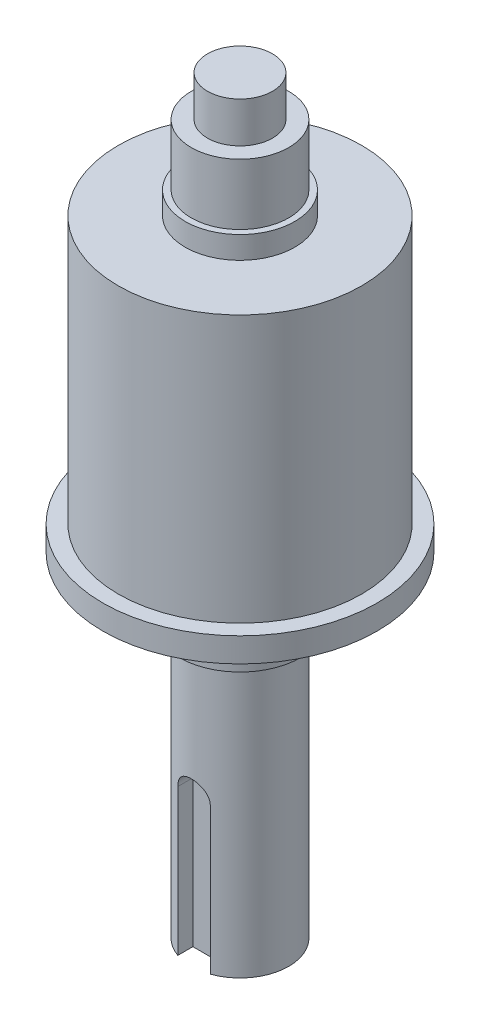
ISO-10303-21;
HEADER;
FILE_DESCRIPTION(('STEP AP214'),'2;1');
FILE_NAME('part.step','',(''),(''),'','','');
FILE_SCHEMA(('AUTOMOTIVE_DESIGN { 1 0 10303 214 1 1 1 1 }'));
ENDSEC;
DATA;
#1=APPLICATION_CONTEXT('core data for automotive mechanical design processes');
#2=APPLICATION_PROTOCOL_DEFINITION('international standard','automotive_design',2000,#1);
#3=PRODUCT_CONTEXT('',#1,'mechanical');
#4=PRODUCT('Part','Part','',(#3));
#5=PRODUCT_RELATED_PRODUCT_CATEGORY('part','',(#4));
#6=PRODUCT_DEFINITION_FORMATION('','',#4);
#7=PRODUCT_DEFINITION_CONTEXT('part definition',#1,'design');
#8=PRODUCT_DEFINITION('design','',#6,#7);
#9=PRODUCT_DEFINITION_SHAPE('','',#8);
#10=(LENGTH_UNIT() NAMED_UNIT(*) SI_UNIT(.MILLI.,.METRE.));
#11=(NAMED_UNIT(*) PLANE_ANGLE_UNIT() SI_UNIT($,.RADIAN.));
#12=(NAMED_UNIT(*) SI_UNIT($,.STERADIAN.) SOLID_ANGLE_UNIT());
#13=UNCERTAINTY_MEASURE_WITH_UNIT(LENGTH_MEASURE(1.E-05),#10,'distance_accuracy_value','');
#14=(GEOMETRIC_REPRESENTATION_CONTEXT(3) GLOBAL_UNCERTAINTY_ASSIGNED_CONTEXT((#13)) GLOBAL_UNIT_ASSIGNED_CONTEXT((#10,
#11,#12)) REPRESENTATION_CONTEXT('',''));
#15=CARTESIAN_POINT('',(0.,0.,0.));
#16=DIRECTION('',(0.,0.,1.));
#17=DIRECTION('',(1.,0.,0.));
#18=AXIS2_PLACEMENT_3D('',#15,#16,#17);
#19=CARTESIAN_POINT('',(0.,40.0334496894889,0.));
#20=DIRECTION('',(0.,1.,0.));
#21=DIRECTION('',(0.,0.,1.));
#22=AXIS2_PLACEMENT_3D('',#19,#20,#21);
#23=CYLINDRICAL_SURFACE('',#22,6.);
#24=CARTESIAN_POINT('',(0.,-58.61,0.));
#25=DIRECTION('',(0.,1.,0.));
#26=DIRECTION('',(0.,0.,1.));
#27=AXIS2_PLACEMENT_3D('',#24,#25,#26);
#28=CIRCLE('',#27,6.);
#29=CARTESIAN_POINT('',(0.,-58.61,6.));
#30=VERTEX_POINT('',#29);
#31=EDGE_CURVE('E116',#30,#30,#28,.T.);
#32=ORIENTED_EDGE('',*,*,#31,.F.);
#33=EDGE_LOOP('',(#32));
#34=FACE_BOUND('',#33,.T.);
#35=CARTESIAN_POINT('',(-2.,-74.285,5.65685424949238));
#36=CARTESIAN_POINT('',(-2.0000014949184,-74.2304190063978,5.65684884188678));
#37=CARTESIAN_POINT('',(-1.99776424917478,-74.1758658756214,5.6576451988649));
#38=CARTESIAN_POINT('',(-1.9888512140728,-74.0671828318902,5.66078654578441));
#39=CARTESIAN_POINT('',(-1.98217662286705,-74.0130528086806,5.66313111768244));
#40=CARTESIAN_POINT('',(-1.95562135046158,-73.8522157136097,5.67238184449301));
#41=CARTESIAN_POINT('',(-1.92920846605623,-73.7466383074591,5.6815058499903));
#42=CARTESIAN_POINT('',(-1.85991682366086,-73.5417496151125,5.70456149397718));
#43=CARTESIAN_POINT('',(-1.81704715197507,-73.4424349062541,5.71849047905858));
#44=CARTESIAN_POINT('',(-1.71614645792974,-73.2523203319891,5.74957574438921));
#45=CARTESIAN_POINT('',(-1.65810612564547,-73.1615257418653,5.76673400456216));
#46=CARTESIAN_POINT('',(-1.52610278704603,-72.9875595373509,5.80308960804095));
#47=CARTESIAN_POINT('',(-1.45164996064407,-72.9047702390748,5.82233755536617));
#48=CARTESIAN_POINT('',(-1.28997688598297,-72.7525879644166,5.86027697385955));
#49=CARTESIAN_POINT('',(-1.20275436910907,-72.6831973734881,5.87896834543705));
#50=CARTESIAN_POINT('',(-1.01520729191253,-72.5580409623916,5.91427765988454));
#51=CARTESIAN_POINT('',(-0.914600178716996,-72.5026780311955,5.93082875123708));
#52=CARTESIAN_POINT('',(-0.704858499931721,-72.4098154966255,5.95939217209316));
#53=CARTESIAN_POINT('',(-0.595726551186841,-72.3723104363591,5.97140588786619));
#54=CARTESIAN_POINT('',(-0.376058690956074,-72.3175285478173,5.98918142285845));
#55=CARTESIAN_POINT('',(-0.265703668920226,-72.2995934548926,5.99514617977146));
#56=CARTESIAN_POINT('',(-0.04339793891135,-72.2823674029488,6.00087216807633));
#57=CARTESIAN_POINT('',(0.0685523824907802,-72.2830720014605,6.00063487762604));
#58=CARTESIAN_POINT('',(0.286207690558779,-72.3026885662133,5.99412077270532));
#59=CARTESIAN_POINT('',(0.391985405251067,-72.3208852759189,5.98808121982527));
#60=CARTESIAN_POINT('',(0.598888128753307,-72.3737863973482,5.97093921001647));
#61=CARTESIAN_POINT('',(0.700012879232924,-72.4084917244125,5.95983647235462));
#62=CARTESIAN_POINT('',(0.89630524606192,-72.4938427392013,5.93351336542608));
#63=CARTESIAN_POINT('',(0.991377011307978,-72.5446920902447,5.91824075676625));
#64=CARTESIAN_POINT('',(1.17184917819497,-72.6607199027814,5.88516775360088));
#65=CARTESIAN_POINT('',(1.25724693942937,-72.725902262093,5.86736667195186));
#66=CARTESIAN_POINT('',(1.42019467942242,-72.8723420999937,5.83012543885479));
#67=CARTESIAN_POINT('',(1.49718722322539,-72.9542110872194,5.81064757359828));
#68=CARTESIAN_POINT('',(1.63654404964076,-73.1298829794323,5.77294980945703));
#69=CARTESIAN_POINT('',(1.69890360636762,-73.2236897248065,5.75473031831506));
#70=CARTESIAN_POINT('',(1.80800665118556,-73.4223603567065,5.72140062752635));
#71=CARTESIAN_POINT('',(1.85450601901536,-73.5273670298659,5.70634029896469));
#72=CARTESIAN_POINT('',(1.92892046140223,-73.7442939551799,5.68162194124078));
#73=CARTESIAN_POINT('',(1.95686487211071,-73.8562029867443,5.67195538817986));
#74=CARTESIAN_POINT('',(1.98331631256166,-74.021837273496,5.6627308418944));
#75=CARTESIAN_POINT('',(1.98957012251023,-74.0742827797085,5.66053335389204));
#76=CARTESIAN_POINT('',(1.99790923214239,-74.1794761567996,5.65759407142798));
#77=CARTESIAN_POINT('',(1.99999991078996,-74.2322235490888,5.65685039859056));
#78=CARTESIAN_POINT('',(2.,-74.285,5.65685424949238));
#79=B_SPLINE_CURVE_WITH_KNOTS('',3,(#35,#36,#37,#38,#39,#40,#41,#42,#43,#44,#45,#46,#47,#48,#49,
#50,#51,#52,#53,#54,#55,#56,#57,#58,#59,#60,#61,#62,#63,#64,#65,#66,#67,#68,#69,#70,#71,#72,#73,
#74,#75,#76,#77,#78),.UNSPECIFIED.,.F.,.F.,(4,2,2,2,2,2,2,2,2,2,2,2,2,2,2,2,2,2,2,2,2,4),(0.,
0.163636969470853,0.327229772338919,0.653162396790742,0.978915321932481,1.30486862627062,
1.64233009925354,1.97985159727494,2.32618265866202,2.67240782242254,3.00658941454805,
3.34069136061284,3.66168836931469,3.98270317816495,4.30794037651934,4.63326613177536,
4.97388108116099,5.31460588498483,5.66036059856078,6.00556734973678,6.16399790665503,
6.32222363058113),.UNSPECIFIED.);
#80=CARTESIAN_POINT('',(-2.,-74.285,5.65685424949238));
#81=VERTEX_POINT('',#80);
#82=CARTESIAN_POINT('',(2.,-74.285,5.65685424949238));
#83=VERTEX_POINT('',#82);
#84=EDGE_CURVE('E11',#81,#83,#79,.T.);
#85=ORIENTED_EDGE('',*,*,#84,.T.);
#86=DIRECTION('',(0.,-1.,0.));
#87=VECTOR('',#86,1.);
#88=CARTESIAN_POINT('',(2.,-77.285,5.65685424949237));
#89=LINE('',#88,#87);
#90=CARTESIAN_POINT('',(2.,-92.285,5.65685424949237));
#91=VERTEX_POINT('',#90);
#92=EDGE_CURVE('E91',#83,#91,#89,.T.);
#93=ORIENTED_EDGE('',*,*,#92,.T.);
#94=CARTESIAN_POINT('',(0.,-92.285,0.));
#95=DIRECTION('',(0.,1.,0.));
#96=DIRECTION('',(0.,0.,1.));
#97=AXIS2_PLACEMENT_3D('',#94,#95,#96);
#98=CIRCLE('',#97,6.);
#99=CARTESIAN_POINT('',(-2.,-92.285,5.65685424949238));
#100=VERTEX_POINT('',#99);
#101=EDGE_CURVE('E110',#91,#100,#98,.T.);
#102=ORIENTED_EDGE('',*,*,#101,.T.);
#103=DIRECTION('',(0.,-1.,0.));
#104=VECTOR('',#103,1.);
#105=CARTESIAN_POINT('',(-2.,-77.285,5.65685424949237));
#106=LINE('',#105,#104);
#107=EDGE_CURVE('E57',#81,#100,#106,.T.);
#108=ORIENTED_EDGE('',*,*,#107,.F.);
#109=EDGE_LOOP('',(#85,#93,#102,#108));
#110=FACE_BOUND('',#109,.T.);
#111=ADVANCED_FACE('F36',(#34,#110),#23,.T.);
#112=CARTESIAN_POINT('',(0.,0.,0.));
#113=DIRECTION('',(0.,1.,0.));
#114=DIRECTION('',(0.,0.,1.));
#115=AXIS2_PLACEMENT_3D('',#112,#113,#114);
#116=PLANE('',#115);
#117=CARTESIAN_POINT('',(0.,0.,0.));
#118=DIRECTION('',(0.,1.,0.));
#119=DIRECTION('',(0.,0.,1.));
#120=AXIS2_PLACEMENT_3D('',#117,#118,#119);
#121=CIRCLE('',#120,4.);
#122=CARTESIAN_POINT('',(0.,0.,4.));
#123=VERTEX_POINT('',#122);
#124=EDGE_CURVE('E50',#123,#123,#121,.T.);
#125=ORIENTED_EDGE('',*,*,#124,.T.);
#126=EDGE_LOOP('',(#125));
#127=FACE_BOUND('',#126,.T.);
#128=ADVANCED_FACE('F38',(#127),#116,.T.);
#129=CARTESIAN_POINT('',(0.,40.0334496894889,0.));
#130=DIRECTION('',(0.,1.,0.));
#131=DIRECTION('',(0.,0.,1.));
#132=AXIS2_PLACEMENT_3D('',#129,#130,#131);
#133=CYLINDRICAL_SURFACE('',#132,4.);
#134=CARTESIAN_POINT('',(0.,-5.,0.));
#135=DIRECTION('',(0.,1.,0.));
#136=DIRECTION('',(0.,0.,1.));
#137=AXIS2_PLACEMENT_3D('',#134,#135,#136);
#138=CIRCLE('',#137,4.);
#139=CARTESIAN_POINT('',(0.,-5.,4.));
#140=VERTEX_POINT('',#139);
#141=EDGE_CURVE('E155',#140,#140,#138,.T.);
#142=ORIENTED_EDGE('',*,*,#141,.T.);
#143=EDGE_LOOP('',(#142));
#144=FACE_BOUND('',#143,.T.);
#145=ORIENTED_EDGE('',*,*,#124,.F.);
#146=EDGE_LOOP('',(#145));
#147=FACE_BOUND('',#146,.T.);
#148=ADVANCED_FACE('F161',(#144,#147),#133,.T.);
#149=CARTESIAN_POINT('',(-4.,-5.,0.));
#150=DIRECTION('',(0.,1.,0.));
#151=DIRECTION('',(0.,0.,1.));
#152=AXIS2_PLACEMENT_3D('',#149,#150,#151);
#153=PLANE('',#152);
#154=CARTESIAN_POINT('',(0.,-5.,0.));
#155=DIRECTION('',(0.,1.,0.));
#156=DIRECTION('',(0.,0.,1.));
#157=AXIS2_PLACEMENT_3D('',#154,#155,#156);
#158=CIRCLE('',#157,6.);
#159=CARTESIAN_POINT('',(0.,-5.,6.));
#160=VERTEX_POINT('',#159);
#161=EDGE_CURVE('E152',#160,#160,#158,.T.);
#162=ORIENTED_EDGE('',*,*,#161,.T.);
#163=EDGE_LOOP('',(#162));
#164=FACE_BOUND('',#163,.T.);
#165=ORIENTED_EDGE('',*,*,#141,.F.);
#166=EDGE_LOOP('',(#165));
#167=FACE_BOUND('',#166,.T.);
#168=ADVANCED_FACE('F163',(#164,#167),#153,.T.);
#169=CARTESIAN_POINT('',(0.,40.0334496894889,0.));
#170=DIRECTION('',(0.,1.,0.));
#171=DIRECTION('',(0.,0.,1.));
#172=AXIS2_PLACEMENT_3D('',#169,#170,#171);
#173=CYLINDRICAL_SURFACE('',#172,6.);
#174=CARTESIAN_POINT('',(0.,-12.5,0.));
#175=DIRECTION('',(0.,1.,0.));
#176=DIRECTION('',(0.,0.,1.));
#177=AXIS2_PLACEMENT_3D('',#174,#175,#176);
#178=CIRCLE('',#177,6.);
#179=CARTESIAN_POINT('',(0.,-12.5,6.));
#180=VERTEX_POINT('',#179);
#181=EDGE_CURVE('E149',#180,#180,#178,.T.);
#182=ORIENTED_EDGE('',*,*,#181,.T.);
#183=EDGE_LOOP('',(#182));
#184=FACE_BOUND('',#183,.T.);
#185=ORIENTED_EDGE('',*,*,#161,.F.);
#186=EDGE_LOOP('',(#185));
#187=FACE_BOUND('',#186,.T.);
#188=ADVANCED_FACE('F169',(#184,#187),#173,.T.);
#189=CARTESIAN_POINT('',(-6.,-12.5,0.));
#190=DIRECTION('',(0.,1.,0.));
#191=DIRECTION('',(0.,0.,1.));
#192=AXIS2_PLACEMENT_3D('',#189,#190,#191);
#193=PLANE('',#192);
#194=CARTESIAN_POINT('',(0.,-12.5,0.));
#195=DIRECTION('',(0.,1.,0.));
#196=DIRECTION('',(0.,0.,1.));
#197=AXIS2_PLACEMENT_3D('',#194,#195,#196);
#198=CIRCLE('',#197,6.75);
#199=CARTESIAN_POINT('',(0.,-12.5,6.75));
#200=VERTEX_POINT('',#199);
#201=EDGE_CURVE('E146',#200,#200,#198,.T.);
#202=ORIENTED_EDGE('',*,*,#201,.T.);
#203=EDGE_LOOP('',(#202));
#204=FACE_BOUND('',#203,.T.);
#205=ORIENTED_EDGE('',*,*,#181,.F.);
#206=EDGE_LOOP('',(#205));
#207=FACE_BOUND('',#206,.T.);
#208=ADVANCED_FACE('F222',(#204,#207),#193,.T.);
#209=CARTESIAN_POINT('',(0.,40.0334496894889,0.));
#210=DIRECTION('',(0.,1.,0.));
#211=DIRECTION('',(0.,0.,1.));
#212=AXIS2_PLACEMENT_3D('',#209,#210,#211);
#213=CYLINDRICAL_SURFACE('',#212,6.75);
#214=CARTESIAN_POINT('',(0.,-15.25,0.));
#215=DIRECTION('',(0.,1.,0.));
#216=DIRECTION('',(0.,0.,1.));
#217=AXIS2_PLACEMENT_3D('',#214,#215,#216);
#218=CIRCLE('',#217,6.75);
#219=CARTESIAN_POINT('',(0.,-15.25,6.75));
#220=VERTEX_POINT('',#219);
#221=EDGE_CURVE('E143',#220,#220,#218,.T.);
#222=ORIENTED_EDGE('',*,*,#221,.T.);
#223=EDGE_LOOP('',(#222));
#224=FACE_BOUND('',#223,.T.);
#225=ORIENTED_EDGE('',*,*,#201,.F.);
#226=EDGE_LOOP('',(#225));
#227=FACE_BOUND('',#226,.T.);
#228=ADVANCED_FACE('F218',(#224,#227),#213,.T.);
#229=CARTESIAN_POINT('',(-6.75,-15.25,0.));
#230=DIRECTION('',(0.,1.,0.));
#231=DIRECTION('',(0.,0.,1.));
#232=AXIS2_PLACEMENT_3D('',#229,#230,#231);
#233=PLANE('',#232);
#234=CARTESIAN_POINT('',(0.,-15.25,0.));
#235=DIRECTION('',(0.,1.,0.));
#236=DIRECTION('',(0.,0.,1.));
#237=AXIS2_PLACEMENT_3D('',#234,#235,#236);
#238=CIRCLE('',#237,14.9815);
#239=CARTESIAN_POINT('',(0.,-15.25,14.9815));
#240=VERTEX_POINT('',#239);
#241=EDGE_CURVE('E140',#240,#240,#238,.T.);
#242=ORIENTED_EDGE('',*,*,#241,.T.);
#243=EDGE_LOOP('',(#242));
#244=FACE_BOUND('',#243,.T.);
#245=ORIENTED_EDGE('',*,*,#221,.F.);
#246=EDGE_LOOP('',(#245));
#247=FACE_BOUND('',#246,.T.);
#248=ADVANCED_FACE('F214',(#244,#247),#233,.T.);
#249=CARTESIAN_POINT('',(0.,40.0334496894889,0.));
#250=DIRECTION('',(0.,1.,0.));
#251=DIRECTION('',(0.,0.,1.));
#252=AXIS2_PLACEMENT_3D('',#249,#250,#251);
#253=CYLINDRICAL_SURFACE('',#252,14.9815);
#254=CARTESIAN_POINT('',(0.,-48.11,0.));
#255=DIRECTION('',(0.,1.,0.));
#256=DIRECTION('',(0.,0.,1.));
#257=AXIS2_PLACEMENT_3D('',#254,#255,#256);
#258=CIRCLE('',#257,14.9815);
#259=CARTESIAN_POINT('',(0.,-48.11,14.9815));
#260=VERTEX_POINT('',#259);
#261=EDGE_CURVE('E137',#260,#260,#258,.T.);
#262=ORIENTED_EDGE('',*,*,#261,.T.);
#263=EDGE_LOOP('',(#262));
#264=FACE_BOUND('',#263,.T.);
#265=ORIENTED_EDGE('',*,*,#241,.F.);
#266=EDGE_LOOP('',(#265));
#267=FACE_BOUND('',#266,.T.);
#268=ADVANCED_FACE('F210',(#264,#267),#253,.T.);
#269=CARTESIAN_POINT('',(-16.8815,-48.11,0.));
#270=DIRECTION('',(0.,1.,0.));
#271=DIRECTION('',(0.,0.,1.));
#272=AXIS2_PLACEMENT_3D('',#269,#270,#271);
#273=PLANE('',#272);
#274=CARTESIAN_POINT('',(0.,-48.11,0.));
#275=DIRECTION('',(0.,1.,0.));
#276=DIRECTION('',(0.,0.,1.));
#277=AXIS2_PLACEMENT_3D('',#274,#275,#276);
#278=CIRCLE('',#277,16.8815);
#279=CARTESIAN_POINT('',(0.,-48.11,16.8815));
#280=VERTEX_POINT('',#279);
#281=EDGE_CURVE('E134',#280,#280,#278,.T.);
#282=ORIENTED_EDGE('',*,*,#281,.T.);
#283=EDGE_LOOP('',(#282));
#284=FACE_BOUND('',#283,.T.);
#285=ORIENTED_EDGE('',*,*,#261,.F.);
#286=EDGE_LOOP('',(#285));
#287=FACE_BOUND('',#286,.T.);
#288=ADVANCED_FACE('F206',(#284,#287),#273,.T.);
#289=CARTESIAN_POINT('',(0.,40.0334496894889,0.));
#290=DIRECTION('',(0.,1.,0.));
#291=DIRECTION('',(0.,0.,1.));
#292=AXIS2_PLACEMENT_3D('',#289,#290,#291);
#293=CYLINDRICAL_SURFACE('',#292,16.8815);
#294=CARTESIAN_POINT('',(0.,-51.11,0.));
#295=DIRECTION('',(0.,1.,0.));
#296=DIRECTION('',(0.,0.,1.));
#297=AXIS2_PLACEMENT_3D('',#294,#295,#296);
#298=CIRCLE('',#297,16.8815);
#299=CARTESIAN_POINT('',(0.,-51.11,16.8815));
#300=VERTEX_POINT('',#299);
#301=EDGE_CURVE('E131',#300,#300,#298,.T.);
#302=ORIENTED_EDGE('',*,*,#301,.T.);
#303=EDGE_LOOP('',(#302));
#304=FACE_BOUND('',#303,.T.);
#305=ORIENTED_EDGE('',*,*,#281,.F.);
#306=EDGE_LOOP('',(#305));
#307=FACE_BOUND('',#306,.T.);
#308=ADVANCED_FACE('F202',(#304,#307),#293,.T.);
#309=CARTESIAN_POINT('',(-16.8815,-51.11,0.));
#310=DIRECTION('',(0.,-1.,0.));
#311=DIRECTION('',(0.,0.,-1.));
#312=AXIS2_PLACEMENT_3D('',#309,#310,#311);
#313=PLANE('',#312);
#314=CARTESIAN_POINT('',(0.,-51.11,0.));
#315=DIRECTION('',(0.,1.,0.));
#316=DIRECTION('',(0.,0.,1.));
#317=AXIS2_PLACEMENT_3D('',#314,#315,#316);
#318=CIRCLE('',#317,8.25);
#319=CARTESIAN_POINT('',(0.,-51.11,8.25));
#320=VERTEX_POINT('',#319);
#321=EDGE_CURVE('E128',#320,#320,#318,.T.);
#322=ORIENTED_EDGE('',*,*,#321,.T.);
#323=EDGE_LOOP('',(#322));
#324=FACE_BOUND('',#323,.T.);
#325=ORIENTED_EDGE('',*,*,#301,.F.);
#326=EDGE_LOOP('',(#325));
#327=FACE_BOUND('',#326,.T.);
#328=ADVANCED_FACE('F198',(#324,#327),#313,.T.);
#329=CARTESIAN_POINT('',(0.,40.0334496894889,0.));
#330=DIRECTION('',(0.,1.,0.));
#331=DIRECTION('',(0.,0.,1.));
#332=AXIS2_PLACEMENT_3D('',#329,#330,#331);
#333=CYLINDRICAL_SURFACE('',#332,8.25);
#334=CARTESIAN_POINT('',(0.,-53.61,0.));
#335=DIRECTION('',(0.,1.,0.));
#336=DIRECTION('',(0.,0.,1.));
#337=AXIS2_PLACEMENT_3D('',#334,#335,#336);
#338=CIRCLE('',#337,8.25);
#339=CARTESIAN_POINT('',(0.,-53.61,8.25));
#340=VERTEX_POINT('',#339);
#341=EDGE_CURVE('E125',#340,#340,#338,.T.);
#342=ORIENTED_EDGE('',*,*,#341,.T.);
#343=EDGE_LOOP('',(#342));
#344=FACE_BOUND('',#343,.T.);
#345=ORIENTED_EDGE('',*,*,#321,.F.);
#346=EDGE_LOOP('',(#345));
#347=FACE_BOUND('',#346,.T.);
#348=ADVANCED_FACE('F194',(#344,#347),#333,.T.);
#349=CARTESIAN_POINT('',(-8.25,-53.61,0.));
#350=DIRECTION('',(0.,-1.,0.));
#351=DIRECTION('',(0.,0.,-1.));
#352=AXIS2_PLACEMENT_3D('',#349,#350,#351);
#353=PLANE('',#352);
#354=CARTESIAN_POINT('',(0.,-53.61,0.));
#355=DIRECTION('',(0.,1.,0.));
#356=DIRECTION('',(0.,0.,1.));
#357=AXIS2_PLACEMENT_3D('',#354,#355,#356);
#358=CIRCLE('',#357,7.5);
#359=CARTESIAN_POINT('',(0.,-53.61,7.5));
#360=VERTEX_POINT('',#359);
#361=EDGE_CURVE('E122',#360,#360,#358,.T.);
#362=ORIENTED_EDGE('',*,*,#361,.T.);
#363=EDGE_LOOP('',(#362));
#364=FACE_BOUND('',#363,.T.);
#365=ORIENTED_EDGE('',*,*,#341,.F.);
#366=EDGE_LOOP('',(#365));
#367=FACE_BOUND('',#366,.T.);
#368=ADVANCED_FACE('F190',(#364,#367),#353,.T.);
#369=CARTESIAN_POINT('',(0.,40.0334496894889,0.));
#370=DIRECTION('',(0.,1.,0.));
#371=DIRECTION('',(0.,0.,1.));
#372=AXIS2_PLACEMENT_3D('',#369,#370,#371);
#373=CYLINDRICAL_SURFACE('',#372,7.5);
#374=CARTESIAN_POINT('',(0.,-58.61,0.));
#375=DIRECTION('',(0.,1.,0.));
#376=DIRECTION('',(0.,0.,1.));
#377=AXIS2_PLACEMENT_3D('',#374,#375,#376);
#378=CIRCLE('',#377,7.5);
#379=CARTESIAN_POINT('',(0.,-58.61,7.5));
#380=VERTEX_POINT('',#379);
#381=EDGE_CURVE('E119',#380,#380,#378,.T.);
#382=ORIENTED_EDGE('',*,*,#381,.T.);
#383=EDGE_LOOP('',(#382));
#384=FACE_BOUND('',#383,.T.);
#385=ORIENTED_EDGE('',*,*,#361,.F.);
#386=EDGE_LOOP('',(#385));
#387=FACE_BOUND('',#386,.T.);
#388=ADVANCED_FACE('F186',(#384,#387),#373,.T.);
#389=CARTESIAN_POINT('',(-7.5,-58.61,0.));
#390=DIRECTION('',(0.,-1.,0.));
#391=DIRECTION('',(0.,0.,-1.));
#392=AXIS2_PLACEMENT_3D('',#389,#390,#391);
#393=PLANE('',#392);
#394=ORIENTED_EDGE('',*,*,#31,.T.);
#395=EDGE_LOOP('',(#394));
#396=FACE_BOUND('',#395,.T.);
#397=ORIENTED_EDGE('',*,*,#381,.F.);
#398=EDGE_LOOP('',(#397));
#399=FACE_BOUND('',#398,.T.);
#400=ADVANCED_FACE('F183',(#396,#399),#393,.T.);
#401=CARTESIAN_POINT('',(-6.,-92.285,0.));
#402=DIRECTION('',(0.,-1.,0.));
#403=DIRECTION('',(0.,0.,-1.));
#404=AXIS2_PLACEMENT_3D('',#401,#402,#403);
#405=PLANE('',#404);
#406=DIRECTION('',(0.,0.,1.));
#407=VECTOR('',#406,1.);
#408=CARTESIAN_POINT('',(2.,-92.285,3.80000000000001));
#409=LINE('',#408,#407);
#410=CARTESIAN_POINT('',(2.,-92.285,3.80000000000001));
#411=VERTEX_POINT('',#410);
#412=EDGE_CURVE('E65',#411,#91,#409,.T.);
#413=ORIENTED_EDGE('',*,*,#412,.F.);
#414=DIRECTION('',(1.,0.,0.));
#415=VECTOR('',#414,1.);
#416=CARTESIAN_POINT('',(-2.,-92.285,3.80000000000001));
#417=LINE('',#416,#415);
#418=CARTESIAN_POINT('',(-2.,-92.285,3.80000000000001));
#419=VERTEX_POINT('',#418);
#420=EDGE_CURVE('E90',#419,#411,#417,.T.);
#421=ORIENTED_EDGE('',*,*,#420,.F.);
#422=DIRECTION('',(0.,0.,-1.));
#423=VECTOR('',#422,1.);
#424=CARTESIAN_POINT('',(-2.,-92.285,5.65685424949237));
#425=LINE('',#424,#423);
#426=EDGE_CURVE('E99',#100,#419,#425,.T.);
#427=ORIENTED_EDGE('',*,*,#426,.F.);
#428=ORIENTED_EDGE('',*,*,#101,.F.);
#429=EDGE_LOOP('',(#413,#421,#427,#428));
#430=FACE_BOUND('',#429,.T.);
#431=ADVANCED_FACE('F181',(#430),#405,.T.);
#432=CARTESIAN_POINT('',(2.,-77.285,3.80000000000001));
#433=DIRECTION('',(1.,0.,0.));
#434=DIRECTION('',(0.,0.,-1.));
#435=AXIS2_PLACEMENT_3D('',#432,#433,#434);
#436=PLANE('',#435);
#437=ORIENTED_EDGE('',*,*,#412,.T.);
#438=ORIENTED_EDGE('',*,*,#92,.F.);
#439=DIRECTION('',(0.,0.,-1.));
#440=VECTOR('',#439,1.);
#441=CARTESIAN_POINT('',(2.,-74.285,16.8815));
#442=LINE('',#441,#440);
#443=CARTESIAN_POINT('',(2.,-74.285,3.80000000000001));
#444=VERTEX_POINT('',#443);
#445=EDGE_CURVE('E95',#83,#444,#442,.T.);
#446=ORIENTED_EDGE('',*,*,#445,.T.);
#447=DIRECTION('',(0.,-1.,0.));
#448=VECTOR('',#447,1.);
#449=CARTESIAN_POINT('',(2.,-77.285,3.80000000000001));
#450=LINE('',#449,#448);
#451=EDGE_CURVE('E84',#444,#411,#450,.T.);
#452=ORIENTED_EDGE('',*,*,#451,.T.);
#453=EDGE_LOOP('',(#437,#438,#446,#452));
#454=FACE_BOUND('',#453,.T.);
#455=ADVANCED_FACE('F96',(#454),#436,.F.);
#456=CARTESIAN_POINT('',(-2.,-77.285,3.80000000000001));
#457=DIRECTION('',(0.,0.,-1.));
#458=DIRECTION('',(-1.,0.,0.));
#459=AXIS2_PLACEMENT_3D('',#456,#457,#458);
#460=PLANE('',#459);
#461=ORIENTED_EDGE('',*,*,#420,.T.);
#462=ORIENTED_EDGE('',*,*,#451,.F.);
#463=CARTESIAN_POINT('',(0.,-74.285,3.80000000000001));
#464=DIRECTION('',(0.,0.,1.));
#465=DIRECTION('',(-1.,0.,0.));
#466=AXIS2_PLACEMENT_3D('',#463,#464,#465);
#467=CIRCLE('',#466,2.);
#468=CARTESIAN_POINT('',(-2.,-74.285,3.80000000000001));
#469=VERTEX_POINT('',#468);
#470=EDGE_CURVE('E88',#444,#469,#467,.T.);
#471=ORIENTED_EDGE('',*,*,#470,.T.);
#472=DIRECTION('',(0.,-1.,0.));
#473=VECTOR('',#472,1.);
#474=CARTESIAN_POINT('',(-2.,-77.285,3.80000000000001));
#475=LINE('',#474,#473);
#476=EDGE_CURVE('E92',#469,#419,#475,.T.);
#477=ORIENTED_EDGE('',*,*,#476,.T.);
#478=EDGE_LOOP('',(#461,#462,#471,#477));
#479=FACE_BOUND('',#478,.T.);
#480=ADVANCED_FACE('F86',(#479),#460,.F.);
#481=CARTESIAN_POINT('',(-2.,-77.285,5.65685424949237));
#482=DIRECTION('',(-1.,0.,0.));
#483=DIRECTION('',(0.,0.,1.));
#484=AXIS2_PLACEMENT_3D('',#481,#482,#483);
#485=PLANE('',#484);
#486=ORIENTED_EDGE('',*,*,#426,.T.);
#487=ORIENTED_EDGE('',*,*,#476,.F.);
#488=DIRECTION('',(0.,0.,-1.));
#489=VECTOR('',#488,1.);
#490=CARTESIAN_POINT('',(-2.,-74.285,16.8815));
#491=LINE('',#490,#489);
#492=EDGE_CURVE('E100',#81,#469,#491,.T.);
#493=ORIENTED_EDGE('',*,*,#492,.F.);
#494=ORIENTED_EDGE('',*,*,#107,.T.);
#495=EDGE_LOOP('',(#486,#487,#493,#494));
#496=FACE_BOUND('',#495,.T.);
#497=ADVANCED_FACE('F301',(#496),#485,.F.);
#498=CARTESIAN_POINT('',(0.,-74.285,16.8815));
#499=DIRECTION('',(0.,0.,-1.));
#500=DIRECTION('',(-1.,0.,0.));
#501=AXIS2_PLACEMENT_3D('',#498,#499,#500);
#502=CYLINDRICAL_SURFACE('',#501,2.);
#503=ORIENTED_EDGE('',*,*,#492,.T.);
#504=ORIENTED_EDGE('',*,*,#470,.F.);
#505=ORIENTED_EDGE('',*,*,#445,.F.);
#506=ORIENTED_EDGE('',*,*,#84,.F.);
#507=EDGE_LOOP('',(#503,#504,#505,#506));
#508=FACE_BOUND('',#507,.T.);
#509=ADVANCED_FACE('F103',(#508),#502,.F.);
#510=CLOSED_SHELL('',(#111,#128,#148,#168,#188,#208,#228,#248,#268,#288,#308,#328,#348,#368,
#388,#400,#431,#455,#480,#497,#509));
#511=MANIFOLD_SOLID_BREP('B2',#510);
#512=ADVANCED_BREP_SHAPE_REPRESENTATION('',(#18,#511),#14);
#513=SHAPE_DEFINITION_REPRESENTATION(#9,#512);
ENDSEC;
END-ISO-10303-21;
